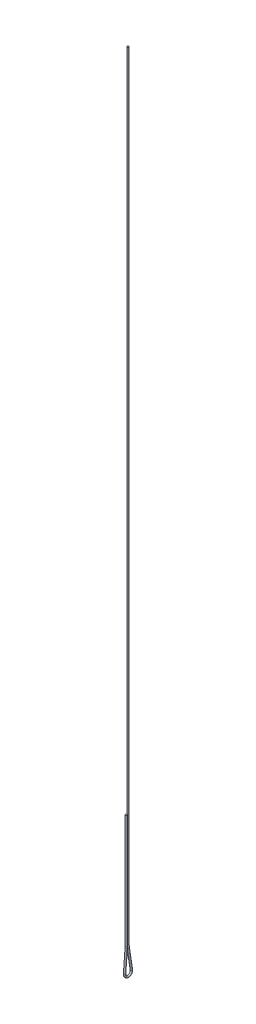
ISO-10303-21;
HEADER;
FILE_DESCRIPTION(('STEP AP214'),'2;1');
FILE_NAME('part.step','',(''),(''),'','','');
FILE_SCHEMA(('AUTOMOTIVE_DESIGN { 1 0 10303 214 1 1 1 1 }'));
ENDSEC;
DATA;
#1=APPLICATION_CONTEXT('core data for automotive mechanical design processes');
#2=APPLICATION_PROTOCOL_DEFINITION('international standard','automotive_design',2000,#1);
#3=PRODUCT_CONTEXT('',#1,'mechanical');
#4=PRODUCT('Part','Part','',(#3));
#5=PRODUCT_RELATED_PRODUCT_CATEGORY('part','',(#4));
#6=PRODUCT_DEFINITION_FORMATION('','',#4);
#7=PRODUCT_DEFINITION_CONTEXT('part definition',#1,'design');
#8=PRODUCT_DEFINITION('design','',#6,#7);
#9=PRODUCT_DEFINITION_SHAPE('','',#8);
#10=(LENGTH_UNIT() NAMED_UNIT(*) SI_UNIT(.MILLI.,.METRE.));
#11=(NAMED_UNIT(*) PLANE_ANGLE_UNIT() SI_UNIT($,.RADIAN.));
#12=(NAMED_UNIT(*) SI_UNIT($,.STERADIAN.) SOLID_ANGLE_UNIT());
#13=UNCERTAINTY_MEASURE_WITH_UNIT(LENGTH_MEASURE(1.E-05),#10,'distance_accuracy_value','');
#14=(GEOMETRIC_REPRESENTATION_CONTEXT(3) GLOBAL_UNCERTAINTY_ASSIGNED_CONTEXT((#13)) GLOBAL_UNIT_ASSIGNED_CONTEXT((#10,
#11,#12)) REPRESENTATION_CONTEXT('',''));
#15=CARTESIAN_POINT('',(0.,0.,0.));
#16=DIRECTION('',(0.,0.,1.));
#17=DIRECTION('',(1.,0.,0.));
#18=AXIS2_PLACEMENT_3D('',#15,#16,#17);
#19=CARTESIAN_POINT('',(0.,21.5085337780988,0.));
#20=DIRECTION('',(0.,1.,0.));
#21=DIRECTION('',(0.,0.,1.));
#22=AXIS2_PLACEMENT_3D('',#19,#20,#21);
#23=CYLINDRICAL_SURFACE('',#22,0.75);
#24=CARTESIAN_POINT('',(0.,21.5085337780988,0.));
#25=DIRECTION('',(0.,-1.,0.));
#26=DIRECTION('',(0.,0.,-1.));
#27=AXIS2_PLACEMENT_3D('',#24,#25,#26);
#28=CIRCLE('',#27,0.75);
#29=CARTESIAN_POINT('',(0.,21.5085337780989,0.749999999999998));
#30=VERTEX_POINT('',#29);
#31=EDGE_CURVE('E39',#30,#30,#28,.T.);
#32=CARTESIAN_POINT('',(0.,700.,0.));
#33=DIRECTION('',(0.,-1.,0.));
#34=DIRECTION('',(0.,0.,-1.));
#35=AXIS2_PLACEMENT_3D('',#32,#33,#34);
#36=CIRCLE('',#35,0.75);
#37=CARTESIAN_POINT('',(0.,700.,0.749999999999998));
#38=VERTEX_POINT('',#37);
#39=EDGE_CURVE('E10',#38,#38,#36,.T.);
#40=CARTESIAN_POINT('',(0.,21.5085337780989,0.749999999999998));
#41=CARTESIAN_POINT('',(0.,28.5761532179103,0.749999999999998));
#42=CARTESIAN_POINT('',(0.,35.6437726577218,0.749999999999998));
#43=CARTESIAN_POINT('',(0.,49.7790115373447,0.749999999999998));
#44=CARTESIAN_POINT('',(0.,56.8466309771562,0.749999999999998));
#45=CARTESIAN_POINT('',(0.,70.9818698567792,0.749999999999998));
#46=CARTESIAN_POINT('',(0.,78.0494892965906,0.749999999999998));
#47=CARTESIAN_POINT('',(0.,92.1847281762136,0.749999999999998));
#48=CARTESIAN_POINT('',(0.,99.252347616025,0.749999999999998));
#49=CARTESIAN_POINT('',(0.,113.387586495648,0.749999999999998));
#50=CARTESIAN_POINT('',(0.,120.455205935459,0.749999999999998));
#51=CARTESIAN_POINT('',(0.,134.590444815082,0.749999999999998));
#52=CARTESIAN_POINT('',(0.,141.658064254894,0.749999999999998));
#53=CARTESIAN_POINT('',(0.,155.793303134517,0.749999999999998));
#54=CARTESIAN_POINT('',(0.,162.860922574328,0.749999999999998));
#55=CARTESIAN_POINT('',(0.,176.996161453951,0.749999999999998));
#56=CARTESIAN_POINT('',(0.,184.063780893763,0.749999999999998));
#57=CARTESIAN_POINT('',(0.,198.199019773386,0.749999999999998));
#58=CARTESIAN_POINT('',(0.,205.266639213197,0.749999999999998));
#59=CARTESIAN_POINT('',(0.,219.40187809282,0.749999999999998));
#60=CARTESIAN_POINT('',(0.,226.469497532632,0.749999999999998));
#61=CARTESIAN_POINT('',(0.,240.604736412255,0.749999999999998));
#62=CARTESIAN_POINT('',(0.,247.672355852066,0.749999999999998));
#63=CARTESIAN_POINT('',(0.,261.807594731689,0.749999999999998));
#64=CARTESIAN_POINT('',(0.,268.8752141715,0.749999999999998));
#65=CARTESIAN_POINT('',(0.,283.010453051123,0.749999999999998));
#66=CARTESIAN_POINT('',(0.,290.078072490935,0.749999999999998));
#67=CARTESIAN_POINT('',(0.,304.213311370558,0.749999999999998));
#68=CARTESIAN_POINT('',(0.,311.280930810369,0.749999999999998));
#69=CARTESIAN_POINT('',(0.,325.416169689992,0.749999999999998));
#70=CARTESIAN_POINT('',(0.,332.483789129804,0.749999999999998));
#71=CARTESIAN_POINT('',(0.,346.619028009427,0.749999999999998));
#72=CARTESIAN_POINT('',(0.,353.686647449238,0.749999999999998));
#73=CARTESIAN_POINT('',(0.,367.821886328861,0.749999999999998));
#74=CARTESIAN_POINT('',(0.,374.889505768672,0.749999999999998));
#75=CARTESIAN_POINT('',(0.,389.024744648295,0.749999999999998));
#76=CARTESIAN_POINT('',(0.,396.092364088107,0.749999999999998));
#77=CARTESIAN_POINT('',(0.,410.22760296773,0.749999999999998));
#78=CARTESIAN_POINT('',(0.,417.295222407541,0.749999999999998));
#79=CARTESIAN_POINT('',(0.,431.430461287164,0.749999999999998));
#80=CARTESIAN_POINT('',(0.,438.498080726976,0.749999999999998));
#81=CARTESIAN_POINT('',(0.,452.633319606599,0.749999999999998));
#82=CARTESIAN_POINT('',(0.,459.70093904641,0.749999999999998));
#83=CARTESIAN_POINT('',(0.,473.836177926033,0.749999999999998));
#84=CARTESIAN_POINT('',(0.,480.903797365845,0.749999999999998));
#85=CARTESIAN_POINT('',(0.,495.039036245468,0.749999999999998));
#86=CARTESIAN_POINT('',(0.,502.106655685279,0.749999999999998));
#87=CARTESIAN_POINT('',(0.,516.241894564902,0.749999999999998));
#88=CARTESIAN_POINT('',(0.,523.309514004713,0.749999999999998));
#89=CARTESIAN_POINT('',(0.,537.444752884336,0.749999999999998));
#90=CARTESIAN_POINT('',(0.,544.512372324148,0.749999999999998));
#91=CARTESIAN_POINT('',(0.,558.647611203771,0.749999999999998));
#92=CARTESIAN_POINT('',(0.,565.715230643582,0.749999999999998));
#93=CARTESIAN_POINT('',(0.,579.850469523205,0.749999999999998));
#94=CARTESIAN_POINT('',(0.,586.918088963017,0.749999999999998));
#95=CARTESIAN_POINT('',(0.,601.05332784264,0.749999999999998));
#96=CARTESIAN_POINT('',(0.,608.120947282451,0.749999999999998));
#97=CARTESIAN_POINT('',(0.,622.256186162074,0.749999999999998));
#98=CARTESIAN_POINT('',(0.,629.323805601885,0.749999999999998));
#99=CARTESIAN_POINT('',(0.,643.459044481508,0.749999999999998));
#100=CARTESIAN_POINT('',(0.,650.52666392132,0.749999999999998));
#101=CARTESIAN_POINT('',(0.,664.661902800943,0.749999999999998));
#102=CARTESIAN_POINT('',(0.,671.729522240754,0.749999999999998));
#103=CARTESIAN_POINT('',(0.,685.864761120377,0.749999999999998));
#104=CARTESIAN_POINT('',(0.,692.932380560189,0.749999999999998));
#105=CARTESIAN_POINT('',(0.,700.,0.749999999999998));
#106=B_SPLINE_CURVE_WITH_KNOTS('',3,(#40,#41,#42,#43,#44,#45,#46,#47,#48,#49,#50,#51,#52,#53,
#54,#55,#56,#57,#58,#59,#60,#61,#62,#63,#64,#65,#66,#67,#68,#69,#70,#71,#72,#73,#74,#75,#76,#77,
#78,#79,#80,#81,#82,#83,#84,#85,#86,#87,#88,#89,#90,#91,#92,#93,#94,#95,#96,#97,#98,#99,#100,
#101,#102,#103,#104,#105),.UNSPECIFIED.,.F.,.F.,(4,2,2,2,2,2,2,2,2,2,2,2,2,2,2,2,2,2,2,2,2,2,2,
2,2,2,2,2,2,2,2,2,4),(0.,21.2028583194344,42.4057166388688,63.6085749583032,84.8114332777377,
106.014291597172,127.217149916607,148.420008236041,169.622866555475,190.82572487491,
212.028583194344,233.231441513779,254.434299833213,275.637158152647,296.840016472082,
318.042874791516,339.245733110951,360.448591430385,381.65144974982,402.854308069254,
424.057166388688,445.260024708123,466.462883027557,487.665741346992,508.868599666426,
530.07145798586,551.274316305295,572.477174624729,593.680032944164,614.882891263598,
636.085749583032,657.288607902467,678.491466221901),.UNSPECIFIED.);
#107=EDGE_CURVE('BSEAM33',#30,#38,#106,.T.);
#108=ORIENTED_EDGE('',*,*,#31,.F.);
#109=ORIENTED_EDGE('',*,*,#39,.T.);
#110=ORIENTED_EDGE('',*,*,#107,.T.);
#111=ORIENTED_EDGE('',*,*,#107,.F.);
#112=EDGE_LOOP('',(#108,#110,#109,#111));
#113=FACE_BOUND('',#112,.T.);
#114=ADVANCED_FACE('F33',(#113),#23,.T.);
#115=CARTESIAN_POINT('',(0.,21.5085337780987,-20.));
#116=DIRECTION('',(-1.,0.,0.));
#117=DIRECTION('',(0.,0.,1.));
#118=AXIS2_PLACEMENT_3D('',#115,#116,#117);
#119=TOROIDAL_SURFACE('',#118,20.,0.75);
#120=CARTESIAN_POINT('',(0.,18.5085337780987,-0.22628006671482));
#121=DIRECTION('',(0.,-0.988685996664258,-0.150000000000006));
#122=DIRECTION('',(0.,0.150000000000006,-0.988685996664258));
#123=AXIS2_PLACEMENT_3D('',#120,#121,#122);
#124=CIRCLE('',#123,0.75);
#125=CARTESIAN_POINT('',(0.,18.3960337780987,0.515234430783374));
#126=VERTEX_POINT('',#125);
#127=EDGE_CURVE('E43',#126,#126,#124,.T.);
#128=CARTESIAN_POINT('',(0.,21.5085337780987,-20.));
#129=DIRECTION('',(-1.,0.,0.));
#130=DIRECTION('',(0.,0.,1.));
#131=AXIS2_PLACEMENT_3D('',#128,#129,#130);
#132=CIRCLE('',#131,20.75);
#133=EDGE_CURVE('',#126,#30,#132,.T.);
#134=ORIENTED_EDGE('',*,*,#127,.F.);
#135=ORIENTED_EDGE('',*,*,#31,.T.);
#136=ORIENTED_EDGE('',*,*,#133,.T.);
#137=ORIENTED_EDGE('',*,*,#133,.F.);
#138=EDGE_LOOP('',(#134,#136,#135,#137));
#139=FACE_BOUND('',#138,.T.);
#140=ADVANCED_FACE('F89',(#139),#119,.T.);
#141=CARTESIAN_POINT('',(0.,0.450000000000035,-2.96605798999278));
#142=DIRECTION('',(0.,0.988685996664259,0.15));
#143=DIRECTION('',(0.,-0.15,0.98868599666426));
#144=AXIS2_PLACEMENT_3D('',#141,#142,#143);
#145=CYLINDRICAL_SURFACE('',#144,0.75);
#146=CARTESIAN_POINT('',(0.,0.450000000000035,-2.96605798999278));
#147=DIRECTION('',(0.,-0.988685996664258,-0.150000000000006));
#148=DIRECTION('',(0.,0.150000000000006,-0.988685996664258));
#149=AXIS2_PLACEMENT_3D('',#146,#147,#148);
#150=CIRCLE('',#149,0.75);
#151=CARTESIAN_POINT('',(0.,0.562500000000044,-3.70757248749097));
#152=VERTEX_POINT('',#151);
#153=EDGE_CURVE('E47',#152,#152,#150,.T.);
#154=ORIENTED_EDGE('',*,*,#153,.F.);
#155=EDGE_LOOP('',(#154));
#156=FACE_BOUND('',#155,.T.);
#157=ORIENTED_EDGE('',*,*,#127,.T.);
#158=EDGE_LOOP('',(#157));
#159=FACE_BOUND('',#158,.T.);
#160=ADVANCED_FACE('F83',(#156,#159),#145,.T.);
#161=CARTESIAN_POINT('',(0.,0.,0.));
#162=DIRECTION('',(1.,0.,0.));
#163=DIRECTION('',(0.,0.,-1.));
#164=AXIS2_PLACEMENT_3D('',#161,#162,#163);
#165=TOROIDAL_SURFACE('',#164,3.,0.75);
#166=CARTESIAN_POINT('',(0.,0.225637304990103,2.99150260013205));
#167=DIRECTION('',(0.,0.997167533377349,-0.0752124349967062));
#168=DIRECTION('',(0.,0.0752124349967062,0.997167533377349));
#169=AXIS2_PLACEMENT_3D('',#166,#167,#168);
#170=CIRCLE('',#169,0.75);
#171=CARTESIAN_POINT('',(0.,0.282046631237629,3.73937825016506));
#172=VERTEX_POINT('',#171);
#173=EDGE_CURVE('E52',#172,#172,#170,.T.);
#174=CARTESIAN_POINT('',(0.,0.,0.));
#175=DIRECTION('',(1.,0.,0.));
#176=DIRECTION('',(0.,0.,-1.));
#177=AXIS2_PLACEMENT_3D('',#174,#175,#176);
#178=CIRCLE('',#177,3.75);
#179=EDGE_CURVE('',#172,#152,#178,.T.);
#180=ORIENTED_EDGE('',*,*,#173,.F.);
#181=ORIENTED_EDGE('',*,*,#153,.T.);
#182=ORIENTED_EDGE('',*,*,#179,.T.);
#183=ORIENTED_EDGE('',*,*,#179,.F.);
#184=EDGE_LOOP('',(#180,#182,#181,#183));
#185=FACE_BOUND('',#184,.T.);
#186=ADVANCED_FACE('F77',(#185),#165,.T.);
#187=CARTESIAN_POINT('',(0.,19.2489423442796,1.55664933245302));
#188=DIRECTION('',(0.,-0.99716753337735,0.0752124349966987));
#189=DIRECTION('',(0.,-0.0752124349966987,-0.99716753337735));
#190=AXIS2_PLACEMENT_3D('',#187,#188,#189);
#191=CYLINDRICAL_SURFACE('',#190,0.75);
#192=CARTESIAN_POINT('',(0.,19.2489423442796,1.55664933245302));
#193=DIRECTION('',(0.,0.997167533377349,-0.0752124349967062));
#194=DIRECTION('',(0.,0.0752124349967062,0.997167533377349));
#195=AXIS2_PLACEMENT_3D('',#192,#193,#194);
#196=CIRCLE('',#195,0.75);
#197=CARTESIAN_POINT('',(0.,19.192533018032,0.808773682420005));
#198=VERTEX_POINT('',#197);
#199=EDGE_CURVE('E55',#198,#198,#196,.T.);
#200=ORIENTED_EDGE('',*,*,#199,.F.);
#201=EDGE_LOOP('',(#200));
#202=FACE_BOUND('',#201,.T.);
#203=ORIENTED_EDGE('',*,*,#173,.T.);
#204=EDGE_LOOP('',(#203));
#205=FACE_BOUND('',#204,.T.);
#206=ADVANCED_FACE('F71',(#202,#205),#191,.T.);
#207=CARTESIAN_POINT('',(0.,20.7531910442136,21.5));
#208=DIRECTION('',(-1.,0.,0.));
#209=DIRECTION('',(0.,0.,1.));
#210=AXIS2_PLACEMENT_3D('',#207,#208,#209);
#211=TOROIDAL_SURFACE('',#210,20.,0.75);
#212=CARTESIAN_POINT('',(0.,20.7531910442137,1.5));
#213=DIRECTION('',(0.,1.,0.));
#214=DIRECTION('',(0.,0.,1.));
#215=AXIS2_PLACEMENT_3D('',#212,#213,#214);
#216=CIRCLE('',#215,0.75);
#217=CARTESIAN_POINT('',(0.,20.7531910442137,0.750000000000001));
#218=VERTEX_POINT('',#217);
#219=EDGE_CURVE('E58',#218,#218,#216,.T.);
#220=CARTESIAN_POINT('',(0.,20.7531910442136,21.5));
#221=DIRECTION('',(-1.,0.,0.));
#222=DIRECTION('',(0.,0.,1.));
#223=AXIS2_PLACEMENT_3D('',#220,#221,#222);
#224=CIRCLE('',#223,20.75);
#225=EDGE_CURVE('',#218,#198,#224,.T.);
#226=ORIENTED_EDGE('',*,*,#219,.F.);
#227=ORIENTED_EDGE('',*,*,#199,.T.);
#228=ORIENTED_EDGE('',*,*,#225,.T.);
#229=ORIENTED_EDGE('',*,*,#225,.F.);
#230=EDGE_LOOP('',(#226,#228,#227,#229));
#231=FACE_BOUND('',#230,.T.);
#232=ADVANCED_FACE('F68',(#231),#211,.T.);
#233=CARTESIAN_POINT('',(0.,20.7531910442137,1.5));
#234=DIRECTION('',(0.,1.,0.));
#235=DIRECTION('',(0.,0.,1.));
#236=AXIS2_PLACEMENT_3D('',#233,#234,#235);
#237=CYLINDRICAL_SURFACE('',#236,0.75);
#238=ORIENTED_EDGE('',*,*,#219,.T.);
#239=EDGE_LOOP('',(#238));
#240=FACE_BOUND('',#239,.T.);
#241=CARTESIAN_POINT('',(0.,120.,1.5));
#242=DIRECTION('',(0.,1.,0.));
#243=DIRECTION('',(0.,0.,1.));
#244=AXIS2_PLACEMENT_3D('',#241,#242,#243);
#245=CIRCLE('',#244,0.75);
#246=CARTESIAN_POINT('',(0.,120.,2.25));
#247=VERTEX_POINT('',#246);
#248=EDGE_CURVE('E59',#247,#247,#245,.T.);
#249=ORIENTED_EDGE('',*,*,#248,.F.);
#250=EDGE_LOOP('',(#249));
#251=FACE_BOUND('',#250,.T.);
#252=ADVANCED_FACE('F65',(#240,#251),#237,.T.);
#253=CARTESIAN_POINT('',(0.,700.,0.));
#254=DIRECTION('',(0.,-1.,0.));
#255=DIRECTION('',(0.,0.,-1.));
#256=AXIS2_PLACEMENT_3D('',#253,#254,#255);
#257=PLANE('',#256);
#258=ORIENTED_EDGE('',*,*,#39,.F.);
#259=EDGE_LOOP('',(#258));
#260=FACE_BOUND('',#259,.T.);
#261=ADVANCED_FACE('F101',(#260),#257,.F.);
#262=CARTESIAN_POINT('',(0.,120.,1.5));
#263=DIRECTION('',(0.,1.,0.));
#264=DIRECTION('',(0.,0.,1.));
#265=AXIS2_PLACEMENT_3D('',#262,#263,#264);
#266=PLANE('',#265);
#267=ORIENTED_EDGE('',*,*,#248,.T.);
#268=EDGE_LOOP('',(#267));
#269=FACE_BOUND('',#268,.T.);
#270=ADVANCED_FACE('F102',(#269),#266,.T.);
#271=CLOSED_SHELL('',(#114,#140,#160,#186,#206,#232,#252,#261,#270));
#272=MANIFOLD_SOLID_BREP('B2',#271);
#273=ADVANCED_BREP_SHAPE_REPRESENTATION('',(#18,#272),#14);
#274=SHAPE_DEFINITION_REPRESENTATION(#9,#273);
ENDSEC;
END-ISO-10303-21;
